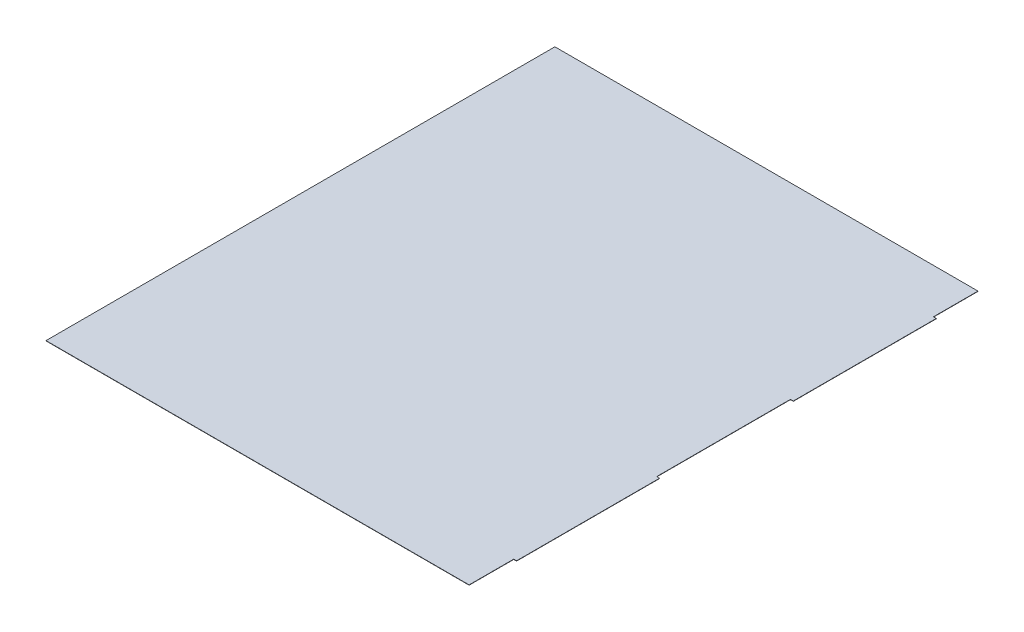
ISO-10303-21;
HEADER;
FILE_DESCRIPTION(('STEP AP214'),'2;1');
FILE_NAME('part.step','',(''),(''),'','','');
FILE_SCHEMA(('AUTOMOTIVE_DESIGN { 1 0 10303 214 1 1 1 1 }'));
ENDSEC;
DATA;
#1=APPLICATION_CONTEXT('core data for automotive mechanical design processes');
#2=APPLICATION_PROTOCOL_DEFINITION('international standard','automotive_design',2000,#1);
#3=PRODUCT_CONTEXT('',#1,'mechanical');
#4=PRODUCT('Part','Part','',(#3));
#5=PRODUCT_RELATED_PRODUCT_CATEGORY('part','',(#4));
#6=PRODUCT_DEFINITION_FORMATION('','',#4);
#7=PRODUCT_DEFINITION_CONTEXT('part definition',#1,'design');
#8=PRODUCT_DEFINITION('design','',#6,#7);
#9=PRODUCT_DEFINITION_SHAPE('','',#8);
#10=(LENGTH_UNIT() NAMED_UNIT(*) SI_UNIT(.MILLI.,.METRE.));
#11=(NAMED_UNIT(*) PLANE_ANGLE_UNIT() SI_UNIT($,.RADIAN.));
#12=(NAMED_UNIT(*) SI_UNIT($,.STERADIAN.) SOLID_ANGLE_UNIT());
#13=UNCERTAINTY_MEASURE_WITH_UNIT(LENGTH_MEASURE(1.E-05),#10,'distance_accuracy_value','');
#14=(GEOMETRIC_REPRESENTATION_CONTEXT(3) GLOBAL_UNCERTAINTY_ASSIGNED_CONTEXT((#13)) GLOBAL_UNIT_ASSIGNED_CONTEXT((#10,
#11,#12)) REPRESENTATION_CONTEXT('',''));
#15=CARTESIAN_POINT('',(0.,0.,0.));
#16=DIRECTION('',(0.,0.,1.));
#17=DIRECTION('',(1.,0.,0.));
#18=AXIS2_PLACEMENT_3D('',#15,#16,#17);
#19=CARTESIAN_POINT('',(3700.,5.,0.));
#20=DIRECTION('',(-1.,0.,0.));
#21=DIRECTION('',(0.,0.,1.));
#22=AXIS2_PLACEMENT_3D('',#19,#20,#21);
#23=PLANE('',#22);
#24=DIRECTION('',(0.,1.,0.));
#25=VECTOR('',#24,1.);
#26=CARTESIAN_POINT('',(3700.,0.,-3670.));
#27=LINE('',#26,#25);
#28=CARTESIAN_POINT('',(3700.,0.,-3670.));
#29=VERTEX_POINT('',#28);
#30=CARTESIAN_POINT('',(3700.,5.,-3670.));
#31=VERTEX_POINT('',#30);
#32=EDGE_CURVE('E155',#29,#31,#27,.T.);
#33=ORIENTED_EDGE('',*,*,#32,.F.);
#34=DIRECTION('',(0.,0.,-1.));
#35=VECTOR('',#34,1.);
#36=CARTESIAN_POINT('',(3700.,0.,0.));
#37=LINE('',#36,#35);
#38=CARTESIAN_POINT('',(3700.,0.,-4450.));
#39=VERTEX_POINT('',#38);
#40=EDGE_CURVE('E210',#29,#39,#37,.T.);
#41=ORIENTED_EDGE('',*,*,#40,.T.);
#42=DIRECTION('',(0.,-1.,0.));
#43=VECTOR('',#42,1.);
#44=CARTESIAN_POINT('',(3700.,5.,-4450.));
#45=LINE('',#44,#43);
#46=CARTESIAN_POINT('',(3700.,5.,-4450.));
#47=VERTEX_POINT('',#46);
#48=EDGE_CURVE('E201',#47,#39,#45,.T.);
#49=ORIENTED_EDGE('',*,*,#48,.F.);
#50=DIRECTION('',(0.,0.,-1.));
#51=VECTOR('',#50,1.);
#52=CARTESIAN_POINT('',(3700.,5.,0.));
#53=LINE('',#52,#51);
#54=EDGE_CURVE('E50',#31,#47,#53,.T.);
#55=ORIENTED_EDGE('',*,*,#54,.F.);
#56=EDGE_LOOP('',(#33,#41,#49,#55));
#57=FACE_BOUND('',#56,.T.);
#58=ADVANCED_FACE('F35',(#57),#23,.F.);
#59=CARTESIAN_POINT('',(3700.,0.,1170.));
#60=VERTEX_POINT('',#59);
#61=CARTESIAN_POINT('',(3700.,0.,-1170.));
#62=VERTEX_POINT('',#61);
#63=EDGE_CURVE('E213',#60,#62,#37,.T.);
#64=ORIENTED_EDGE('',*,*,#63,.T.);
#65=DIRECTION('',(0.,1.,0.));
#66=VECTOR('',#65,1.);
#67=CARTESIAN_POINT('',(3700.,0.,-1170.));
#68=LINE('',#67,#66);
#69=CARTESIAN_POINT('',(3700.,5.,-1170.));
#70=VERTEX_POINT('',#69);
#71=EDGE_CURVE('E58',#62,#70,#68,.T.);
#72=ORIENTED_EDGE('',*,*,#71,.T.);
#73=CARTESIAN_POINT('',(3700.,5.,1170.));
#74=VERTEX_POINT('',#73);
#75=EDGE_CURVE('E148',#74,#70,#53,.T.);
#76=ORIENTED_EDGE('',*,*,#75,.F.);
#77=DIRECTION('',(0.,1.,0.));
#78=VECTOR('',#77,1.);
#79=CARTESIAN_POINT('',(3700.,0.,1170.));
#80=LINE('',#79,#78);
#81=EDGE_CURVE('E183',#60,#74,#80,.T.);
#82=ORIENTED_EDGE('',*,*,#81,.F.);
#83=EDGE_LOOP('',(#64,#72,#76,#82));
#84=FACE_BOUND('',#83,.T.);
#85=ADVANCED_FACE('F251',(#84),#23,.F.);
#86=CARTESIAN_POINT('',(0.,5.,-4450.));
#87=DIRECTION('',(0.,0.,-1.));
#88=DIRECTION('',(-1.,0.,0.));
#89=AXIS2_PLACEMENT_3D('',#86,#87,#88);
#90=PLANE('',#89);
#91=DIRECTION('',(1.,0.,0.));
#92=VECTOR('',#91,1.);
#93=CARTESIAN_POINT('',(0.,0.,-4450.));
#94=LINE('',#93,#92);
#95=CARTESIAN_POINT('',(-3700.,0.,-4450.));
#96=VERTEX_POINT('',#95);
#97=EDGE_CURVE('E182',#96,#39,#94,.T.);
#98=ORIENTED_EDGE('',*,*,#97,.F.);
#99=DIRECTION('',(0.,-1.,0.));
#100=VECTOR('',#99,1.);
#101=CARTESIAN_POINT('',(-3700.,5.,-4450.));
#102=LINE('',#101,#100);
#103=CARTESIAN_POINT('',(-3700.,5.,-4450.));
#104=VERTEX_POINT('',#103);
#105=EDGE_CURVE('E11',#104,#96,#102,.T.);
#106=ORIENTED_EDGE('',*,*,#105,.F.);
#107=DIRECTION('',(1.,0.,0.));
#108=VECTOR('',#107,1.);
#109=CARTESIAN_POINT('',(0.,5.,-4450.));
#110=LINE('',#109,#108);
#111=EDGE_CURVE('E188',#104,#47,#110,.T.);
#112=ORIENTED_EDGE('',*,*,#111,.T.);
#113=ORIENTED_EDGE('',*,*,#48,.T.);
#114=EDGE_LOOP('',(#98,#106,#112,#113));
#115=FACE_BOUND('',#114,.T.);
#116=ADVANCED_FACE('F37',(#115),#90,.T.);
#117=CARTESIAN_POINT('',(-3700.,5.,0.));
#118=DIRECTION('',(-1.,0.,0.));
#119=DIRECTION('',(0.,0.,1.));
#120=AXIS2_PLACEMENT_3D('',#117,#118,#119);
#121=PLANE('',#120);
#122=DIRECTION('',(0.,0.,-1.));
#123=VECTOR('',#122,1.);
#124=CARTESIAN_POINT('',(-3700.,0.,0.));
#125=LINE('',#124,#123);
#126=CARTESIAN_POINT('',(-3700.,0.,4450.));
#127=VERTEX_POINT('',#126);
#128=EDGE_CURVE('E204',#127,#96,#125,.T.);
#129=ORIENTED_EDGE('',*,*,#128,.F.);
#130=DIRECTION('',(0.,-1.,0.));
#131=VECTOR('',#130,1.);
#132=CARTESIAN_POINT('',(-3700.,5.,4450.));
#133=LINE('',#132,#131);
#134=CARTESIAN_POINT('',(-3700.,5.,4450.));
#135=VERTEX_POINT('',#134);
#136=EDGE_CURVE('E43',#135,#127,#133,.T.);
#137=ORIENTED_EDGE('',*,*,#136,.F.);
#138=DIRECTION('',(0.,0.,-1.));
#139=VECTOR('',#138,1.);
#140=CARTESIAN_POINT('',(-3700.,5.,0.));
#141=LINE('',#140,#139);
#142=EDGE_CURVE('E191',#135,#104,#141,.T.);
#143=ORIENTED_EDGE('',*,*,#142,.T.);
#144=ORIENTED_EDGE('',*,*,#105,.T.);
#145=EDGE_LOOP('',(#129,#137,#143,#144));
#146=FACE_BOUND('',#145,.T.);
#147=ADVANCED_FACE('F224',(#146),#121,.T.);
#148=CARTESIAN_POINT('',(1.06821458585556E-12,5.,4450.));
#149=DIRECTION('',(0.,0.,1.));
#150=DIRECTION('',(1.,0.,0.));
#151=AXIS2_PLACEMENT_3D('',#148,#149,#150);
#152=PLANE('',#151);
#153=DIRECTION('',(-1.,0.,0.));
#154=VECTOR('',#153,1.);
#155=CARTESIAN_POINT('',(1.06821458585556E-12,0.,4450.));
#156=LINE('',#155,#154);
#157=CARTESIAN_POINT('',(3700.,0.,4450.));
#158=VERTEX_POINT('',#157);
#159=EDGE_CURVE('E207',#158,#127,#156,.T.);
#160=ORIENTED_EDGE('',*,*,#159,.F.);
#161=DIRECTION('',(0.,-1.,0.));
#162=VECTOR('',#161,1.);
#163=CARTESIAN_POINT('',(3700.,5.,4450.));
#164=LINE('',#163,#162);
#165=CARTESIAN_POINT('',(3700.,5.,4450.));
#166=VERTEX_POINT('',#165);
#167=EDGE_CURVE('E216',#166,#158,#164,.T.);
#168=ORIENTED_EDGE('',*,*,#167,.F.);
#169=DIRECTION('',(-1.,0.,0.));
#170=VECTOR('',#169,1.);
#171=CARTESIAN_POINT('',(1.06821458585556E-12,5.,4450.));
#172=LINE('',#171,#170);
#173=EDGE_CURVE('E195',#166,#135,#172,.T.);
#174=ORIENTED_EDGE('',*,*,#173,.T.);
#175=ORIENTED_EDGE('',*,*,#136,.T.);
#176=EDGE_LOOP('',(#160,#168,#174,#175));
#177=FACE_BOUND('',#176,.T.);
#178=ADVANCED_FACE('F220',(#177),#152,.T.);
#179=CARTESIAN_POINT('',(3700.,0.,3670.));
#180=VERTEX_POINT('',#179);
#181=EDGE_CURVE('E192',#158,#180,#37,.T.);
#182=ORIENTED_EDGE('',*,*,#181,.T.);
#183=DIRECTION('',(0.,1.,0.));
#184=VECTOR('',#183,1.);
#185=CARTESIAN_POINT('',(3700.,0.,3670.));
#186=LINE('',#185,#184);
#187=CARTESIAN_POINT('',(3700.,5.,3670.));
#188=VERTEX_POINT('',#187);
#189=EDGE_CURVE('E179',#180,#188,#186,.T.);
#190=ORIENTED_EDGE('',*,*,#189,.T.);
#191=EDGE_CURVE('E198',#166,#188,#53,.T.);
#192=ORIENTED_EDGE('',*,*,#191,.F.);
#193=ORIENTED_EDGE('',*,*,#167,.T.);
#194=EDGE_LOOP('',(#182,#190,#192,#193));
#195=FACE_BOUND('',#194,.T.);
#196=ADVANCED_FACE('F232',(#195),#23,.F.);
#197=CARTESIAN_POINT('',(0.,5.,0.));
#198=DIRECTION('',(0.,1.,0.));
#199=DIRECTION('',(0.,0.,1.));
#200=AXIS2_PLACEMENT_3D('',#197,#198,#199);
#201=PLANE('',#200);
#202=ORIENTED_EDGE('',*,*,#111,.F.);
#203=ORIENTED_EDGE('',*,*,#142,.F.);
#204=ORIENTED_EDGE('',*,*,#173,.F.);
#205=ORIENTED_EDGE('',*,*,#191,.T.);
#206=DIRECTION('',(1.,0.,0.));
#207=VECTOR('',#206,1.);
#208=CARTESIAN_POINT('',(0.,5.,3670.));
#209=LINE('',#208,#207);
#210=CARTESIAN_POINT('',(3750.,5.,3670.));
#211=VERTEX_POINT('',#210);
#212=EDGE_CURVE('E159',#188,#211,#209,.T.);
#213=ORIENTED_EDGE('',*,*,#212,.T.);
#214=DIRECTION('',(0.,0.,-1.));
#215=VECTOR('',#214,1.);
#216=CARTESIAN_POINT('',(3750.,5.,0.));
#217=LINE('',#216,#215);
#218=CARTESIAN_POINT('',(3750.,5.,1170.));
#219=VERTEX_POINT('',#218);
#220=EDGE_CURVE('E174',#211,#219,#217,.T.);
#221=ORIENTED_EDGE('',*,*,#220,.T.);
#222=DIRECTION('',(1.,0.,0.));
#223=VECTOR('',#222,1.);
#224=CARTESIAN_POINT('',(0.,5.,1170.));
#225=LINE('',#224,#223);
#226=EDGE_CURVE('E166',#74,#219,#225,.T.);
#227=ORIENTED_EDGE('',*,*,#226,.F.);
#228=ORIENTED_EDGE('',*,*,#75,.T.);
#229=DIRECTION('',(1.,0.,0.));
#230=VECTOR('',#229,1.);
#231=CARTESIAN_POINT('',(3700.,5.,-1170.));
#232=LINE('',#231,#230);
#233=CARTESIAN_POINT('',(3750.,5.,-1170.));
#234=VERTEX_POINT('',#233);
#235=EDGE_CURVE('E130',#70,#234,#232,.T.);
#236=ORIENTED_EDGE('',*,*,#235,.T.);
#237=DIRECTION('',(0.,0.,1.));
#238=VECTOR('',#237,1.);
#239=CARTESIAN_POINT('',(3750.,5.,-3670.));
#240=LINE('',#239,#238);
#241=CARTESIAN_POINT('',(3750.,5.,-3670.));
#242=VERTEX_POINT('',#241);
#243=EDGE_CURVE('E137',#242,#234,#240,.T.);
#244=ORIENTED_EDGE('',*,*,#243,.F.);
#245=DIRECTION('',(1.,0.,0.));
#246=VECTOR('',#245,1.);
#247=CARTESIAN_POINT('',(3700.,5.,-3670.));
#248=LINE('',#247,#246);
#249=EDGE_CURVE('E143',#31,#242,#248,.T.);
#250=ORIENTED_EDGE('',*,*,#249,.F.);
#251=ORIENTED_EDGE('',*,*,#54,.T.);
#252=EDGE_LOOP('',(#202,#203,#204,#205,#213,#221,#227,#228,#236,#244,#250,#251));
#253=FACE_BOUND('',#252,.T.);
#254=ADVANCED_FACE('F146',(#253),#201,.T.);
#255=CARTESIAN_POINT('',(0.,0.,0.));
#256=DIRECTION('',(0.,1.,0.));
#257=DIRECTION('',(0.,0.,1.));
#258=AXIS2_PLACEMENT_3D('',#255,#256,#257);
#259=PLANE('',#258);
#260=ORIENTED_EDGE('',*,*,#97,.T.);
#261=ORIENTED_EDGE('',*,*,#40,.F.);
#262=DIRECTION('',(1.,0.,0.));
#263=VECTOR('',#262,1.);
#264=CARTESIAN_POINT('',(3700.,0.,-3670.));
#265=LINE('',#264,#263);
#266=CARTESIAN_POINT('',(3750.,0.,-3670.));
#267=VERTEX_POINT('',#266);
#268=EDGE_CURVE('E149',#29,#267,#265,.T.);
#269=ORIENTED_EDGE('',*,*,#268,.T.);
#270=DIRECTION('',(0.,0.,1.));
#271=VECTOR('',#270,1.);
#272=CARTESIAN_POINT('',(3750.,0.,-3670.));
#273=LINE('',#272,#271);
#274=CARTESIAN_POINT('',(3750.,0.,-1170.));
#275=VERTEX_POINT('',#274);
#276=EDGE_CURVE('E152',#267,#275,#273,.T.);
#277=ORIENTED_EDGE('',*,*,#276,.T.);
#278=DIRECTION('',(1.,0.,0.));
#279=VECTOR('',#278,1.);
#280=CARTESIAN_POINT('',(3700.,0.,-1170.));
#281=LINE('',#280,#279);
#282=EDGE_CURVE('E132',#62,#275,#281,.T.);
#283=ORIENTED_EDGE('',*,*,#282,.F.);
#284=ORIENTED_EDGE('',*,*,#63,.F.);
#285=DIRECTION('',(1.,0.,0.));
#286=VECTOR('',#285,1.);
#287=CARTESIAN_POINT('',(0.,0.,1170.));
#288=LINE('',#287,#286);
#289=CARTESIAN_POINT('',(3750.,0.,1170.));
#290=VERTEX_POINT('',#289);
#291=EDGE_CURVE('E169',#60,#290,#288,.T.);
#292=ORIENTED_EDGE('',*,*,#291,.T.);
#293=DIRECTION('',(0.,0.,-1.));
#294=VECTOR('',#293,1.);
#295=CARTESIAN_POINT('',(3750.,0.,0.));
#296=LINE('',#295,#294);
#297=CARTESIAN_POINT('',(3750.,0.,3670.));
#298=VERTEX_POINT('',#297);
#299=EDGE_CURVE('E165',#298,#290,#296,.T.);
#300=ORIENTED_EDGE('',*,*,#299,.F.);
#301=DIRECTION('',(1.,0.,0.));
#302=VECTOR('',#301,1.);
#303=CARTESIAN_POINT('',(0.,0.,3670.));
#304=LINE('',#303,#302);
#305=EDGE_CURVE('E162',#180,#298,#304,.T.);
#306=ORIENTED_EDGE('',*,*,#305,.F.);
#307=ORIENTED_EDGE('',*,*,#181,.F.);
#308=ORIENTED_EDGE('',*,*,#159,.T.);
#309=ORIENTED_EDGE('',*,*,#128,.T.);
#310=EDGE_LOOP('',(#260,#261,#269,#277,#283,#284,#292,#300,#306,#307,#308,#309));
#311=FACE_BOUND('',#310,.T.);
#312=ADVANCED_FACE('F228',(#311),#259,.F.);
#313=CARTESIAN_POINT('',(0.,0.,3670.));
#314=DIRECTION('',(0.,0.,1.));
#315=DIRECTION('',(1.,0.,0.));
#316=AXIS2_PLACEMENT_3D('',#313,#314,#315);
#317=PLANE('',#316);
#318=ORIENTED_EDGE('',*,*,#212,.F.);
#319=ORIENTED_EDGE('',*,*,#189,.F.);
#320=ORIENTED_EDGE('',*,*,#305,.T.);
#321=DIRECTION('',(0.,1.,0.));
#322=VECTOR('',#321,1.);
#323=CARTESIAN_POINT('',(3750.,0.,3670.));
#324=LINE('',#323,#322);
#325=EDGE_CURVE('E171',#298,#211,#324,.T.);
#326=ORIENTED_EDGE('',*,*,#325,.T.);
#327=EDGE_LOOP('',(#318,#319,#320,#326));
#328=FACE_BOUND('',#327,.T.);
#329=ADVANCED_FACE('F302',(#328),#317,.T.);
#330=CARTESIAN_POINT('',(0.,0.,1170.));
#331=DIRECTION('',(0.,0.,1.));
#332=DIRECTION('',(1.,0.,0.));
#333=AXIS2_PLACEMENT_3D('',#330,#331,#332);
#334=PLANE('',#333);
#335=ORIENTED_EDGE('',*,*,#226,.T.);
#336=DIRECTION('',(0.,1.,0.));
#337=VECTOR('',#336,1.);
#338=CARTESIAN_POINT('',(3750.,0.,1170.));
#339=LINE('',#338,#337);
#340=EDGE_CURVE('E185',#290,#219,#339,.T.);
#341=ORIENTED_EDGE('',*,*,#340,.F.);
#342=ORIENTED_EDGE('',*,*,#291,.F.);
#343=ORIENTED_EDGE('',*,*,#81,.T.);
#344=EDGE_LOOP('',(#335,#341,#342,#343));
#345=FACE_BOUND('',#344,.T.);
#346=ADVANCED_FACE('F247',(#345),#334,.F.);
#347=CARTESIAN_POINT('',(3750.,0.,0.));
#348=DIRECTION('',(1.,0.,0.));
#349=DIRECTION('',(0.,0.,-1.));
#350=AXIS2_PLACEMENT_3D('',#347,#348,#349);
#351=PLANE('',#350);
#352=ORIENTED_EDGE('',*,*,#220,.F.);
#353=ORIENTED_EDGE('',*,*,#325,.F.);
#354=ORIENTED_EDGE('',*,*,#299,.T.);
#355=ORIENTED_EDGE('',*,*,#340,.T.);
#356=EDGE_LOOP('',(#352,#353,#354,#355));
#357=FACE_BOUND('',#356,.T.);
#358=ADVANCED_FACE('F240',(#357),#351,.T.);
#359=CARTESIAN_POINT('',(3700.,0.,-3670.));
#360=DIRECTION('',(0.,0.,1.));
#361=DIRECTION('',(1.,0.,0.));
#362=AXIS2_PLACEMENT_3D('',#359,#360,#361);
#363=PLANE('',#362);
#364=ORIENTED_EDGE('',*,*,#249,.T.);
#365=DIRECTION('',(0.,1.,0.));
#366=VECTOR('',#365,1.);
#367=CARTESIAN_POINT('',(3750.,0.,-3670.));
#368=LINE('',#367,#366);
#369=EDGE_CURVE('E134',#267,#242,#368,.T.);
#370=ORIENTED_EDGE('',*,*,#369,.F.);
#371=ORIENTED_EDGE('',*,*,#268,.F.);
#372=ORIENTED_EDGE('',*,*,#32,.T.);
#373=EDGE_LOOP('',(#364,#370,#371,#372));
#374=FACE_BOUND('',#373,.T.);
#375=ADVANCED_FACE('F237',(#374),#363,.F.);
#376=CARTESIAN_POINT('',(3750.,0.,-3670.));
#377=DIRECTION('',(-1.,0.,0.));
#378=DIRECTION('',(0.,0.,1.));
#379=AXIS2_PLACEMENT_3D('',#376,#377,#378);
#380=PLANE('',#379);
#381=ORIENTED_EDGE('',*,*,#243,.T.);
#382=DIRECTION('',(0.,1.,0.));
#383=VECTOR('',#382,1.);
#384=CARTESIAN_POINT('',(3750.,0.,-1170.));
#385=LINE('',#384,#383);
#386=EDGE_CURVE('E126',#275,#234,#385,.T.);
#387=ORIENTED_EDGE('',*,*,#386,.F.);
#388=ORIENTED_EDGE('',*,*,#276,.F.);
#389=ORIENTED_EDGE('',*,*,#369,.T.);
#390=EDGE_LOOP('',(#381,#387,#388,#389));
#391=FACE_BOUND('',#390,.T.);
#392=ADVANCED_FACE('F138',(#391),#380,.F.);
#393=CARTESIAN_POINT('',(3700.,0.,-1170.));
#394=DIRECTION('',(0.,0.,1.));
#395=DIRECTION('',(1.,0.,0.));
#396=AXIS2_PLACEMENT_3D('',#393,#394,#395);
#397=PLANE('',#396);
#398=ORIENTED_EDGE('',*,*,#235,.F.);
#399=ORIENTED_EDGE('',*,*,#71,.F.);
#400=ORIENTED_EDGE('',*,*,#282,.T.);
#401=ORIENTED_EDGE('',*,*,#386,.T.);
#402=EDGE_LOOP('',(#398,#399,#400,#401));
#403=FACE_BOUND('',#402,.T.);
#404=ADVANCED_FACE('F128',(#403),#397,.T.);
#405=CLOSED_SHELL('',(#58,#85,#116,#147,#178,#196,#254,#312,#329,#346,#358,#375,#392,#404));
#406=MANIFOLD_SOLID_BREP('B2',#405);
#407=ADVANCED_BREP_SHAPE_REPRESENTATION('',(#18,#406),#14);
#408=SHAPE_DEFINITION_REPRESENTATION(#9,#407);
ENDSEC;
END-ISO-10303-21;
